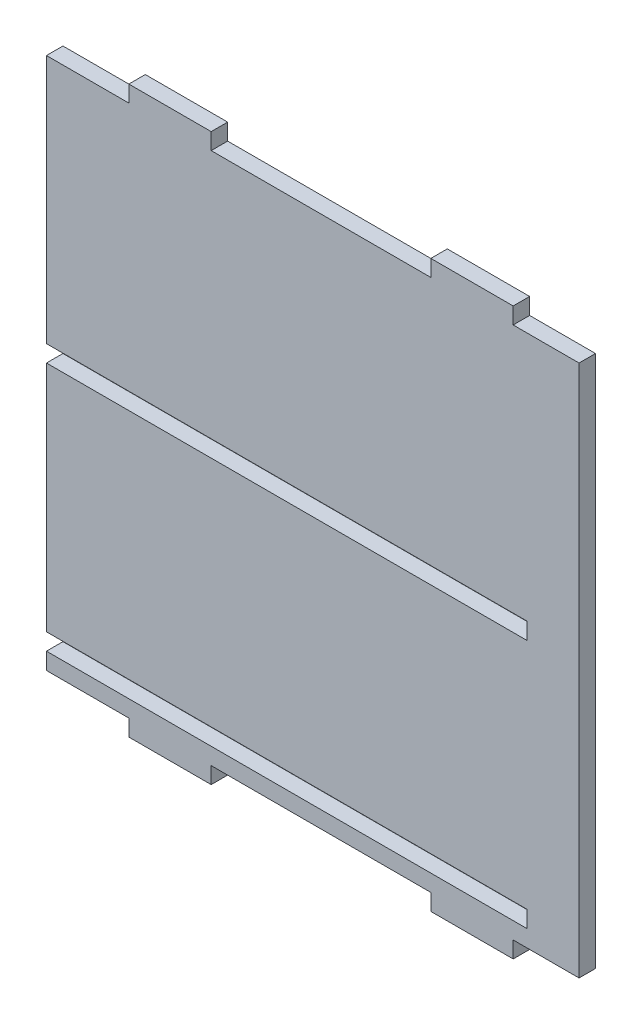
ISO-10303-21;
HEADER;
FILE_DESCRIPTION(('STEP AP214'),'2;1');
FILE_NAME('part.step','',(''),(''),'','','');
FILE_SCHEMA(('AUTOMOTIVE_DESIGN { 1 0 10303 214 1 1 1 1 }'));
ENDSEC;
DATA;
#1=APPLICATION_CONTEXT('core data for automotive mechanical design processes');
#2=APPLICATION_PROTOCOL_DEFINITION('international standard','automotive_design',2000,#1);
#3=PRODUCT_CONTEXT('',#1,'mechanical');
#4=PRODUCT('Part','Part','',(#3));
#5=PRODUCT_RELATED_PRODUCT_CATEGORY('part','',(#4));
#6=PRODUCT_DEFINITION_FORMATION('','',#4);
#7=PRODUCT_DEFINITION_CONTEXT('part definition',#1,'design');
#8=PRODUCT_DEFINITION('design','',#6,#7);
#9=PRODUCT_DEFINITION_SHAPE('','',#8);
#10=(LENGTH_UNIT() NAMED_UNIT(*) SI_UNIT(.MILLI.,.METRE.));
#11=(NAMED_UNIT(*) PLANE_ANGLE_UNIT() SI_UNIT($,.RADIAN.));
#12=(NAMED_UNIT(*) SI_UNIT($,.STERADIAN.) SOLID_ANGLE_UNIT());
#13=UNCERTAINTY_MEASURE_WITH_UNIT(LENGTH_MEASURE(1.E-05),#10,'distance_accuracy_value','');
#14=(GEOMETRIC_REPRESENTATION_CONTEXT(3) GLOBAL_UNCERTAINTY_ASSIGNED_CONTEXT((#13)) GLOBAL_UNIT_ASSIGNED_CONTEXT((#10,
#11,#12)) REPRESENTATION_CONTEXT('',''));
#15=CARTESIAN_POINT('',(0.,0.,0.));
#16=DIRECTION('',(0.,0.,1.));
#17=DIRECTION('',(1.,0.,0.));
#18=AXIS2_PLACEMENT_3D('',#15,#16,#17);
#19=CARTESIAN_POINT('',(-97.,97.,6.));
#20=DIRECTION('',(1.,0.,0.));
#21=DIRECTION('',(0.,1.,0.));
#22=AXIS2_PLACEMENT_3D('',#19,#20,#21);
#23=PLANE('',#22);
#24=DIRECTION('',(0.,-1.,0.));
#25=VECTOR('',#24,1.);
#26=CARTESIAN_POINT('',(-97.,97.,0.));
#27=LINE('',#26,#25);
#28=CARTESIAN_POINT('',(-97.,97.,0.));
#29=VERTEX_POINT('',#28);
#30=CARTESIAN_POINT('',(-97.,6.1,0.));
#31=VERTEX_POINT('',#30);
#32=EDGE_CURVE('E327',#29,#31,#27,.T.);
#33=ORIENTED_EDGE('',*,*,#32,.T.);
#34=DIRECTION('',(0.,0.,1.));
#35=VECTOR('',#34,1.);
#36=CARTESIAN_POINT('',(-97.,6.1,-4.));
#37=LINE('',#36,#35);
#38=CARTESIAN_POINT('',(-97.,6.1,6.));
#39=VERTEX_POINT('',#38);
#40=EDGE_CURVE('E296',#31,#39,#37,.T.);
#41=ORIENTED_EDGE('',*,*,#40,.T.);
#42=DIRECTION('',(0.,-1.,0.));
#43=VECTOR('',#42,1.);
#44=CARTESIAN_POINT('',(-97.,97.,6.));
#45=LINE('',#44,#43);
#46=CARTESIAN_POINT('',(-97.,97.,6.));
#47=VERTEX_POINT('',#46);
#48=EDGE_CURVE('E257',#47,#39,#45,.T.);
#49=ORIENTED_EDGE('',*,*,#48,.F.);
#50=DIRECTION('',(0.,0.,-1.));
#51=VECTOR('',#50,1.);
#52=CARTESIAN_POINT('',(-97.,97.,6.));
#53=LINE('',#52,#51);
#54=EDGE_CURVE('E392',#47,#29,#53,.T.);
#55=ORIENTED_EDGE('',*,*,#54,.T.);
#56=EDGE_LOOP('',(#33,#41,#49,#55));
#57=FACE_BOUND('',#56,.T.);
#58=ADVANCED_FACE('F44',(#57),#23,.F.);
#59=CARTESIAN_POINT('',(-97.,0.,6.));
#60=VERTEX_POINT('',#59);
#61=CARTESIAN_POINT('',(-97.,-84.8,6.));
#62=VERTEX_POINT('',#61);
#63=EDGE_CURVE('E246',#60,#62,#45,.T.);
#64=ORIENTED_EDGE('',*,*,#63,.F.);
#65=DIRECTION('',(0.,0.,1.));
#66=VECTOR('',#65,1.);
#67=CARTESIAN_POINT('',(-97.,0.,-4.));
#68=LINE('',#67,#66);
#69=CARTESIAN_POINT('',(-97.,0.,0.));
#70=VERTEX_POINT('',#69);
#71=EDGE_CURVE('E227',#70,#60,#68,.T.);
#72=ORIENTED_EDGE('',*,*,#71,.F.);
#73=CARTESIAN_POINT('',(-97.,-84.8,0.));
#74=VERTEX_POINT('',#73);
#75=EDGE_CURVE('E332',#70,#74,#27,.T.);
#76=ORIENTED_EDGE('',*,*,#75,.T.);
#77=DIRECTION('',(0.,0.,1.));
#78=VECTOR('',#77,1.);
#79=CARTESIAN_POINT('',(-97.,-84.8,-4.));
#80=LINE('',#79,#78);
#81=EDGE_CURVE('E255',#74,#62,#80,.T.);
#82=ORIENTED_EDGE('',*,*,#81,.T.);
#83=EDGE_LOOP('',(#64,#72,#76,#82));
#84=FACE_BOUND('',#83,.T.);
#85=ADVANCED_FACE('F254',(#84),#23,.F.);
#86=CARTESIAN_POINT('',(73.,-97.,6.));
#87=DIRECTION('',(0.,1.,0.));
#88=DIRECTION('',(-1.,0.,0.));
#89=AXIS2_PLACEMENT_3D('',#86,#87,#88);
#90=PLANE('',#89);
#91=DIRECTION('',(1.,0.,0.));
#92=VECTOR('',#91,1.);
#93=CARTESIAN_POINT('',(73.,-97.,0.));
#94=LINE('',#93,#92);
#95=CARTESIAN_POINT('',(73.,-97.,0.));
#96=VERTEX_POINT('',#95);
#97=CARTESIAN_POINT('',(97.,-97.,0.));
#98=VERTEX_POINT('',#97);
#99=EDGE_CURVE('E291',#96,#98,#94,.T.);
#100=ORIENTED_EDGE('',*,*,#99,.T.);
#101=DIRECTION('',(0.,0.,-1.));
#102=VECTOR('',#101,1.);
#103=CARTESIAN_POINT('',(97.,-97.,6.));
#104=LINE('',#103,#102);
#105=CARTESIAN_POINT('',(97.,-97.,6.));
#106=VERTEX_POINT('',#105);
#107=EDGE_CURVE('E432',#106,#98,#104,.T.);
#108=ORIENTED_EDGE('',*,*,#107,.F.);
#109=DIRECTION('',(1.,0.,0.));
#110=VECTOR('',#109,1.);
#111=CARTESIAN_POINT('',(73.,-97.,6.));
#112=LINE('',#111,#110);
#113=CARTESIAN_POINT('',(73.,-97.,6.));
#114=VERTEX_POINT('',#113);
#115=EDGE_CURVE('E356',#114,#106,#112,.T.);
#116=ORIENTED_EDGE('',*,*,#115,.F.);
#117=DIRECTION('',(0.,0.,-1.));
#118=VECTOR('',#117,1.);
#119=CARTESIAN_POINT('',(73.,-97.,6.));
#120=LINE('',#119,#118);
#121=EDGE_CURVE('E290',#114,#96,#120,.T.);
#122=ORIENTED_EDGE('',*,*,#121,.T.);
#123=EDGE_LOOP('',(#100,#108,#116,#122));
#124=FACE_BOUND('',#123,.T.);
#125=ADVANCED_FACE('F46',(#124),#90,.F.);
#126=CARTESIAN_POINT('',(97.,97.,6.));
#127=DIRECTION('',(-1.,0.,0.));
#128=DIRECTION('',(0.,-1.,0.));
#129=AXIS2_PLACEMENT_3D('',#126,#127,#128);
#130=PLANE('',#129);
#131=DIRECTION('',(0.,1.,0.));
#132=VECTOR('',#131,1.);
#133=CARTESIAN_POINT('',(97.,97.,0.));
#134=LINE('',#133,#132);
#135=CARTESIAN_POINT('',(97.,97.,0.));
#136=VERTEX_POINT('',#135);
#137=EDGE_CURVE('E295',#98,#136,#134,.T.);
#138=ORIENTED_EDGE('',*,*,#137,.T.);
#139=DIRECTION('',(0.,0.,-1.));
#140=VECTOR('',#139,1.);
#141=CARTESIAN_POINT('',(97.,97.,6.));
#142=LINE('',#141,#140);
#143=CARTESIAN_POINT('',(97.,97.,6.));
#144=VERTEX_POINT('',#143);
#145=EDGE_CURVE('E428',#144,#136,#142,.T.);
#146=ORIENTED_EDGE('',*,*,#145,.F.);
#147=DIRECTION('',(0.,1.,0.));
#148=VECTOR('',#147,1.);
#149=CARTESIAN_POINT('',(97.,97.,6.));
#150=LINE('',#149,#148);
#151=EDGE_CURVE('E499',#106,#144,#150,.T.);
#152=ORIENTED_EDGE('',*,*,#151,.F.);
#153=ORIENTED_EDGE('',*,*,#107,.T.);
#154=EDGE_LOOP('',(#138,#146,#152,#153));
#155=FACE_BOUND('',#154,.T.);
#156=ADVANCED_FACE('F618',(#155),#130,.F.);
#157=CARTESIAN_POINT('',(73.,97.,6.));
#158=DIRECTION('',(0.,-1.,0.));
#159=DIRECTION('',(0.,0.,-1.));
#160=AXIS2_PLACEMENT_3D('',#157,#158,#159);
#161=PLANE('',#160);
#162=DIRECTION('',(-1.,0.,0.));
#163=VECTOR('',#162,1.);
#164=CARTESIAN_POINT('',(73.,97.,0.));
#165=LINE('',#164,#163);
#166=CARTESIAN_POINT('',(73.,97.,0.));
#167=VERTEX_POINT('',#166);
#168=EDGE_CURVE('E299',#136,#167,#165,.T.);
#169=ORIENTED_EDGE('',*,*,#168,.T.);
#170=DIRECTION('',(0.,0.,-1.));
#171=VECTOR('',#170,1.);
#172=CARTESIAN_POINT('',(73.,97.,6.));
#173=LINE('',#172,#171);
#174=CARTESIAN_POINT('',(73.,97.,6.));
#175=VERTEX_POINT('',#174);
#176=EDGE_CURVE('E424',#175,#167,#173,.T.);
#177=ORIENTED_EDGE('',*,*,#176,.F.);
#178=DIRECTION('',(-1.,0.,0.));
#179=VECTOR('',#178,1.);
#180=CARTESIAN_POINT('',(73.,97.,6.));
#181=LINE('',#180,#179);
#182=EDGE_CURVE('E502',#144,#175,#181,.T.);
#183=ORIENTED_EDGE('',*,*,#182,.F.);
#184=ORIENTED_EDGE('',*,*,#145,.T.);
#185=EDGE_LOOP('',(#169,#177,#183,#184));
#186=FACE_BOUND('',#185,.T.);
#187=ADVANCED_FACE('F615',(#186),#161,.F.);
#188=CARTESIAN_POINT('',(73.,97.,6.));
#189=DIRECTION('',(-1.,0.,0.));
#190=DIRECTION('',(0.,0.,1.));
#191=AXIS2_PLACEMENT_3D('',#188,#189,#190);
#192=PLANE('',#191);
#193=DIRECTION('',(0.,1.,0.));
#194=VECTOR('',#193,1.);
#195=CARTESIAN_POINT('',(73.,97.,0.));
#196=LINE('',#195,#194);
#197=CARTESIAN_POINT('',(73.,103.,0.));
#198=VERTEX_POINT('',#197);
#199=EDGE_CURVE('E302',#167,#198,#196,.T.);
#200=ORIENTED_EDGE('',*,*,#199,.T.);
#201=DIRECTION('',(0.,0.,-1.));
#202=VECTOR('',#201,1.);
#203=CARTESIAN_POINT('',(73.,103.,6.));
#204=LINE('',#203,#202);
#205=CARTESIAN_POINT('',(73.,103.,6.));
#206=VERTEX_POINT('',#205);
#207=EDGE_CURVE('E420',#206,#198,#204,.T.);
#208=ORIENTED_EDGE('',*,*,#207,.F.);
#209=DIRECTION('',(0.,1.,0.));
#210=VECTOR('',#209,1.);
#211=CARTESIAN_POINT('',(73.,97.,6.));
#212=LINE('',#211,#210);
#213=EDGE_CURVE('E505',#175,#206,#212,.T.);
#214=ORIENTED_EDGE('',*,*,#213,.F.);
#215=ORIENTED_EDGE('',*,*,#176,.T.);
#216=EDGE_LOOP('',(#200,#208,#214,#215));
#217=FACE_BOUND('',#216,.T.);
#218=ADVANCED_FACE('F611',(#217),#192,.F.);
#219=CARTESIAN_POINT('',(43.,103.,6.));
#220=DIRECTION('',(0.,-1.,0.));
#221=DIRECTION('',(0.,0.,-1.));
#222=AXIS2_PLACEMENT_3D('',#219,#220,#221);
#223=PLANE('',#222);
#224=DIRECTION('',(-1.,0.,0.));
#225=VECTOR('',#224,1.);
#226=CARTESIAN_POINT('',(43.,103.,0.));
#227=LINE('',#226,#225);
#228=CARTESIAN_POINT('',(43.,103.,0.));
#229=VERTEX_POINT('',#228);
#230=EDGE_CURVE('E305',#198,#229,#227,.T.);
#231=ORIENTED_EDGE('',*,*,#230,.T.);
#232=DIRECTION('',(0.,0.,-1.));
#233=VECTOR('',#232,1.);
#234=CARTESIAN_POINT('',(43.,103.,6.));
#235=LINE('',#234,#233);
#236=CARTESIAN_POINT('',(43.,103.,6.));
#237=VERTEX_POINT('',#236);
#238=EDGE_CURVE('E416',#237,#229,#235,.T.);
#239=ORIENTED_EDGE('',*,*,#238,.F.);
#240=DIRECTION('',(-1.,0.,0.));
#241=VECTOR('',#240,1.);
#242=CARTESIAN_POINT('',(43.,103.,6.));
#243=LINE('',#242,#241);
#244=EDGE_CURVE('E508',#206,#237,#243,.T.);
#245=ORIENTED_EDGE('',*,*,#244,.F.);
#246=ORIENTED_EDGE('',*,*,#207,.T.);
#247=EDGE_LOOP('',(#231,#239,#245,#246));
#248=FACE_BOUND('',#247,.T.);
#249=ADVANCED_FACE('F607',(#248),#223,.F.);
#250=CARTESIAN_POINT('',(43.,97.,6.));
#251=DIRECTION('',(1.,0.,0.));
#252=DIRECTION('',(0.,0.,-1.));
#253=AXIS2_PLACEMENT_3D('',#250,#251,#252);
#254=PLANE('',#253);
#255=DIRECTION('',(0.,-1.,0.));
#256=VECTOR('',#255,1.);
#257=CARTESIAN_POINT('',(43.,97.,0.));
#258=LINE('',#257,#256);
#259=CARTESIAN_POINT('',(43.,97.,0.));
#260=VERTEX_POINT('',#259);
#261=EDGE_CURVE('E308',#229,#260,#258,.T.);
#262=ORIENTED_EDGE('',*,*,#261,.T.);
#263=DIRECTION('',(0.,0.,-1.));
#264=VECTOR('',#263,1.);
#265=CARTESIAN_POINT('',(43.,97.,6.));
#266=LINE('',#265,#264);
#267=CARTESIAN_POINT('',(43.,97.,6.));
#268=VERTEX_POINT('',#267);
#269=EDGE_CURVE('E412',#268,#260,#266,.T.);
#270=ORIENTED_EDGE('',*,*,#269,.F.);
#271=DIRECTION('',(0.,-1.,0.));
#272=VECTOR('',#271,1.);
#273=CARTESIAN_POINT('',(43.,97.,6.));
#274=LINE('',#273,#272);
#275=EDGE_CURVE('E511',#237,#268,#274,.T.);
#276=ORIENTED_EDGE('',*,*,#275,.F.);
#277=ORIENTED_EDGE('',*,*,#238,.T.);
#278=EDGE_LOOP('',(#262,#270,#276,#277));
#279=FACE_BOUND('',#278,.T.);
#280=ADVANCED_FACE('F603',(#279),#254,.F.);
#281=CARTESIAN_POINT('',(43.,97.,6.));
#282=DIRECTION('',(0.,-1.,0.));
#283=DIRECTION('',(0.,0.,-1.));
#284=AXIS2_PLACEMENT_3D('',#281,#282,#283);
#285=PLANE('',#284);
#286=DIRECTION('',(-1.,0.,0.));
#287=VECTOR('',#286,1.);
#288=CARTESIAN_POINT('',(43.,97.,0.));
#289=LINE('',#288,#287);
#290=CARTESIAN_POINT('',(-37.,97.,0.));
#291=VERTEX_POINT('',#290);
#292=EDGE_CURVE('E311',#260,#291,#289,.T.);
#293=ORIENTED_EDGE('',*,*,#292,.T.);
#294=DIRECTION('',(0.,0.,-1.));
#295=VECTOR('',#294,1.);
#296=CARTESIAN_POINT('',(-37.,97.,6.));
#297=LINE('',#296,#295);
#298=CARTESIAN_POINT('',(-37.,97.,6.));
#299=VERTEX_POINT('',#298);
#300=EDGE_CURVE('E408',#299,#291,#297,.T.);
#301=ORIENTED_EDGE('',*,*,#300,.F.);
#302=DIRECTION('',(-1.,0.,0.));
#303=VECTOR('',#302,1.);
#304=CARTESIAN_POINT('',(43.,97.,6.));
#305=LINE('',#304,#303);
#306=EDGE_CURVE('E514',#268,#299,#305,.T.);
#307=ORIENTED_EDGE('',*,*,#306,.F.);
#308=ORIENTED_EDGE('',*,*,#269,.T.);
#309=EDGE_LOOP('',(#293,#301,#307,#308));
#310=FACE_BOUND('',#309,.T.);
#311=ADVANCED_FACE('F599',(#310),#285,.F.);
#312=CARTESIAN_POINT('',(-37.,97.,6.));
#313=DIRECTION('',(-1.,0.,0.));
#314=DIRECTION('',(0.,0.,1.));
#315=AXIS2_PLACEMENT_3D('',#312,#313,#314);
#316=PLANE('',#315);
#317=DIRECTION('',(0.,1.,0.));
#318=VECTOR('',#317,1.);
#319=CARTESIAN_POINT('',(-37.,97.,0.));
#320=LINE('',#319,#318);
#321=CARTESIAN_POINT('',(-37.,103.,0.));
#322=VERTEX_POINT('',#321);
#323=EDGE_CURVE('E314',#291,#322,#320,.T.);
#324=ORIENTED_EDGE('',*,*,#323,.T.);
#325=DIRECTION('',(0.,0.,-1.));
#326=VECTOR('',#325,1.);
#327=CARTESIAN_POINT('',(-37.,103.,6.));
#328=LINE('',#327,#326);
#329=CARTESIAN_POINT('',(-37.,103.,6.));
#330=VERTEX_POINT('',#329);
#331=EDGE_CURVE('E404',#330,#322,#328,.T.);
#332=ORIENTED_EDGE('',*,*,#331,.F.);
#333=DIRECTION('',(0.,1.,0.));
#334=VECTOR('',#333,1.);
#335=CARTESIAN_POINT('',(-37.,97.,6.));
#336=LINE('',#335,#334);
#337=EDGE_CURVE('E517',#299,#330,#336,.T.);
#338=ORIENTED_EDGE('',*,*,#337,.F.);
#339=ORIENTED_EDGE('',*,*,#300,.T.);
#340=EDGE_LOOP('',(#324,#332,#338,#339));
#341=FACE_BOUND('',#340,.T.);
#342=ADVANCED_FACE('F595',(#341),#316,.F.);
#343=CARTESIAN_POINT('',(-67.,103.,6.));
#344=DIRECTION('',(0.,-1.,0.));
#345=DIRECTION('',(0.,0.,-1.));
#346=AXIS2_PLACEMENT_3D('',#343,#344,#345);
#347=PLANE('',#346);
#348=DIRECTION('',(-1.,0.,0.));
#349=VECTOR('',#348,1.);
#350=CARTESIAN_POINT('',(-67.,103.,0.));
#351=LINE('',#350,#349);
#352=CARTESIAN_POINT('',(-67.,103.,0.));
#353=VERTEX_POINT('',#352);
#354=EDGE_CURVE('E317',#322,#353,#351,.T.);
#355=ORIENTED_EDGE('',*,*,#354,.T.);
#356=DIRECTION('',(0.,0.,-1.));
#357=VECTOR('',#356,1.);
#358=CARTESIAN_POINT('',(-67.,103.,6.));
#359=LINE('',#358,#357);
#360=CARTESIAN_POINT('',(-67.,103.,6.));
#361=VERTEX_POINT('',#360);
#362=EDGE_CURVE('E400',#361,#353,#359,.T.);
#363=ORIENTED_EDGE('',*,*,#362,.F.);
#364=DIRECTION('',(-1.,0.,0.));
#365=VECTOR('',#364,1.);
#366=CARTESIAN_POINT('',(-67.,103.,6.));
#367=LINE('',#366,#365);
#368=EDGE_CURVE('E520',#330,#361,#367,.T.);
#369=ORIENTED_EDGE('',*,*,#368,.F.);
#370=ORIENTED_EDGE('',*,*,#331,.T.);
#371=EDGE_LOOP('',(#355,#363,#369,#370));
#372=FACE_BOUND('',#371,.T.);
#373=ADVANCED_FACE('F589',(#372),#347,.F.);
#374=CARTESIAN_POINT('',(-67.,97.,6.));
#375=DIRECTION('',(1.,0.,0.));
#376=DIRECTION('',(0.,0.,-1.));
#377=AXIS2_PLACEMENT_3D('',#374,#375,#376);
#378=PLANE('',#377);
#379=DIRECTION('',(0.,-1.,0.));
#380=VECTOR('',#379,1.);
#381=CARTESIAN_POINT('',(-67.,97.,0.));
#382=LINE('',#381,#380);
#383=CARTESIAN_POINT('',(-67.,97.,0.));
#384=VERTEX_POINT('',#383);
#385=EDGE_CURVE('E320',#353,#384,#382,.T.);
#386=ORIENTED_EDGE('',*,*,#385,.T.);
#387=DIRECTION('',(0.,0.,-1.));
#388=VECTOR('',#387,1.);
#389=CARTESIAN_POINT('',(-67.,97.,6.));
#390=LINE('',#389,#388);
#391=CARTESIAN_POINT('',(-67.,97.,6.));
#392=VERTEX_POINT('',#391);
#393=EDGE_CURVE('E396',#392,#384,#390,.T.);
#394=ORIENTED_EDGE('',*,*,#393,.F.);
#395=DIRECTION('',(0.,-1.,0.));
#396=VECTOR('',#395,1.);
#397=CARTESIAN_POINT('',(-67.,97.,6.));
#398=LINE('',#397,#396);
#399=EDGE_CURVE('E522',#361,#392,#398,.T.);
#400=ORIENTED_EDGE('',*,*,#399,.F.);
#401=ORIENTED_EDGE('',*,*,#362,.T.);
#402=EDGE_LOOP('',(#386,#394,#400,#401));
#403=FACE_BOUND('',#402,.T.);
#404=ADVANCED_FACE('F585',(#403),#378,.F.);
#405=CARTESIAN_POINT('',(-67.,97.,6.));
#406=DIRECTION('',(0.,-1.,0.));
#407=DIRECTION('',(0.,0.,-1.));
#408=AXIS2_PLACEMENT_3D('',#405,#406,#407);
#409=PLANE('',#408);
#410=DIRECTION('',(-1.,0.,0.));
#411=VECTOR('',#410,1.);
#412=CARTESIAN_POINT('',(-67.,97.,0.));
#413=LINE('',#412,#411);
#414=EDGE_CURVE('E323',#384,#29,#413,.T.);
#415=ORIENTED_EDGE('',*,*,#414,.T.);
#416=ORIENTED_EDGE('',*,*,#54,.F.);
#417=DIRECTION('',(-1.,0.,0.));
#418=VECTOR('',#417,1.);
#419=CARTESIAN_POINT('',(-67.,97.,6.));
#420=LINE('',#419,#418);
#421=EDGE_CURVE('E263',#392,#47,#420,.T.);
#422=ORIENTED_EDGE('',*,*,#421,.F.);
#423=ORIENTED_EDGE('',*,*,#393,.T.);
#424=EDGE_LOOP('',(#415,#416,#422,#423));
#425=FACE_BOUND('',#424,.T.);
#426=ADVANCED_FACE('F531',(#425),#409,.F.);
#427=CARTESIAN_POINT('',(-97.,-90.9,6.));
#428=VERTEX_POINT('',#427);
#429=CARTESIAN_POINT('',(-97.,-97.,6.));
#430=VERTEX_POINT('',#429);
#431=EDGE_CURVE('E258',#428,#430,#45,.T.);
#432=ORIENTED_EDGE('',*,*,#431,.F.);
#433=DIRECTION('',(0.,0.,1.));
#434=VECTOR('',#433,1.);
#435=CARTESIAN_POINT('',(-97.,-90.9,-4.));
#436=LINE('',#435,#434);
#437=CARTESIAN_POINT('',(-97.,-90.9,0.));
#438=VERTEX_POINT('',#437);
#439=EDGE_CURVE('E466',#438,#428,#436,.T.);
#440=ORIENTED_EDGE('',*,*,#439,.F.);
#441=CARTESIAN_POINT('',(-97.,-97.,0.));
#442=VERTEX_POINT('',#441);
#443=EDGE_CURVE('E326',#438,#442,#27,.T.);
#444=ORIENTED_EDGE('',*,*,#443,.T.);
#445=DIRECTION('',(0.,0.,-1.));
#446=VECTOR('',#445,1.);
#447=CARTESIAN_POINT('',(-97.,-97.,6.));
#448=LINE('',#447,#446);
#449=EDGE_CURVE('E388',#430,#442,#448,.T.);
#450=ORIENTED_EDGE('',*,*,#449,.F.);
#451=EDGE_LOOP('',(#432,#440,#444,#450));
#452=FACE_BOUND('',#451,.T.);
#453=ADVANCED_FACE('F464',(#452),#23,.F.);
#454=CARTESIAN_POINT('',(-67.,-97.,6.));
#455=DIRECTION('',(0.,1.,0.));
#456=DIRECTION('',(0.,0.,1.));
#457=AXIS2_PLACEMENT_3D('',#454,#455,#456);
#458=PLANE('',#457);
#459=DIRECTION('',(1.,0.,0.));
#460=VECTOR('',#459,1.);
#461=CARTESIAN_POINT('',(-67.,-97.,0.));
#462=LINE('',#461,#460);
#463=CARTESIAN_POINT('',(-67.,-97.,0.));
#464=VERTEX_POINT('',#463);
#465=EDGE_CURVE('E331',#442,#464,#462,.T.);
#466=ORIENTED_EDGE('',*,*,#465,.T.);
#467=DIRECTION('',(0.,0.,-1.));
#468=VECTOR('',#467,1.);
#469=CARTESIAN_POINT('',(-67.,-97.,6.));
#470=LINE('',#469,#468);
#471=CARTESIAN_POINT('',(-67.,-97.,6.));
#472=VERTEX_POINT('',#471);
#473=EDGE_CURVE('E384',#472,#464,#470,.T.);
#474=ORIENTED_EDGE('',*,*,#473,.F.);
#475=DIRECTION('',(1.,0.,0.));
#476=VECTOR('',#475,1.);
#477=CARTESIAN_POINT('',(-67.,-97.,6.));
#478=LINE('',#477,#476);
#479=EDGE_CURVE('E262',#430,#472,#478,.T.);
#480=ORIENTED_EDGE('',*,*,#479,.F.);
#481=ORIENTED_EDGE('',*,*,#449,.T.);
#482=EDGE_LOOP('',(#466,#474,#480,#481));
#483=FACE_BOUND('',#482,.T.);
#484=ADVANCED_FACE('F470',(#483),#458,.F.);
#485=CARTESIAN_POINT('',(-67.,-97.,6.));
#486=DIRECTION('',(1.,0.,0.));
#487=DIRECTION('',(0.,0.,-1.));
#488=AXIS2_PLACEMENT_3D('',#485,#486,#487);
#489=PLANE('',#488);
#490=DIRECTION('',(0.,-1.,0.));
#491=VECTOR('',#490,1.);
#492=CARTESIAN_POINT('',(-67.,-97.,0.));
#493=LINE('',#492,#491);
#494=CARTESIAN_POINT('',(-67.,-103.,0.));
#495=VERTEX_POINT('',#494);
#496=EDGE_CURVE('E335',#464,#495,#493,.T.);
#497=ORIENTED_EDGE('',*,*,#496,.T.);
#498=DIRECTION('',(0.,0.,-1.));
#499=VECTOR('',#498,1.);
#500=CARTESIAN_POINT('',(-67.,-103.,6.));
#501=LINE('',#500,#499);
#502=CARTESIAN_POINT('',(-67.,-103.,6.));
#503=VERTEX_POINT('',#502);
#504=EDGE_CURVE('E380',#503,#495,#501,.T.);
#505=ORIENTED_EDGE('',*,*,#504,.F.);
#506=DIRECTION('',(0.,-1.,0.));
#507=VECTOR('',#506,1.);
#508=CARTESIAN_POINT('',(-67.,-97.,6.));
#509=LINE('',#508,#507);
#510=EDGE_CURVE('E269',#472,#503,#509,.T.);
#511=ORIENTED_EDGE('',*,*,#510,.F.);
#512=ORIENTED_EDGE('',*,*,#473,.T.);
#513=EDGE_LOOP('',(#497,#505,#511,#512));
#514=FACE_BOUND('',#513,.T.);
#515=ADVANCED_FACE('F477',(#514),#489,.F.);
#516=CARTESIAN_POINT('',(-67.,-103.,6.));
#517=DIRECTION('',(0.,1.,0.));
#518=DIRECTION('',(-1.,0.,0.));
#519=AXIS2_PLACEMENT_3D('',#516,#517,#518);
#520=PLANE('',#519);
#521=DIRECTION('',(1.,0.,0.));
#522=VECTOR('',#521,1.);
#523=CARTESIAN_POINT('',(-67.,-103.,0.));
#524=LINE('',#523,#522);
#525=CARTESIAN_POINT('',(-37.,-103.,0.));
#526=VERTEX_POINT('',#525);
#527=EDGE_CURVE('E338',#495,#526,#524,.T.);
#528=ORIENTED_EDGE('',*,*,#527,.T.);
#529=DIRECTION('',(0.,0.,-1.));
#530=VECTOR('',#529,1.);
#531=CARTESIAN_POINT('',(-37.,-103.,6.));
#532=LINE('',#531,#530);
#533=CARTESIAN_POINT('',(-37.,-103.,6.));
#534=VERTEX_POINT('',#533);
#535=EDGE_CURVE('E376',#534,#526,#532,.T.);
#536=ORIENTED_EDGE('',*,*,#535,.F.);
#537=DIRECTION('',(1.,0.,0.));
#538=VECTOR('',#537,1.);
#539=CARTESIAN_POINT('',(-67.,-103.,6.));
#540=LINE('',#539,#538);
#541=EDGE_CURVE('E272',#503,#534,#540,.T.);
#542=ORIENTED_EDGE('',*,*,#541,.F.);
#543=ORIENTED_EDGE('',*,*,#504,.T.);
#544=EDGE_LOOP('',(#528,#536,#542,#543));
#545=FACE_BOUND('',#544,.T.);
#546=ADVANCED_FACE('F481',(#545),#520,.F.);
#547=CARTESIAN_POINT('',(-37.,-97.,6.));
#548=DIRECTION('',(-1.,0.,0.));
#549=DIRECTION('',(0.,-1.,0.));
#550=AXIS2_PLACEMENT_3D('',#547,#548,#549);
#551=PLANE('',#550);
#552=DIRECTION('',(0.,1.,0.));
#553=VECTOR('',#552,1.);
#554=CARTESIAN_POINT('',(-37.,-97.,0.));
#555=LINE('',#554,#553);
#556=CARTESIAN_POINT('',(-37.,-97.,0.));
#557=VERTEX_POINT('',#556);
#558=EDGE_CURVE('E341',#526,#557,#555,.T.);
#559=ORIENTED_EDGE('',*,*,#558,.T.);
#560=DIRECTION('',(0.,0.,-1.));
#561=VECTOR('',#560,1.);
#562=CARTESIAN_POINT('',(-37.,-97.,6.));
#563=LINE('',#562,#561);
#564=CARTESIAN_POINT('',(-37.,-97.,6.));
#565=VERTEX_POINT('',#564);
#566=EDGE_CURVE('E372',#565,#557,#563,.T.);
#567=ORIENTED_EDGE('',*,*,#566,.F.);
#568=DIRECTION('',(0.,1.,0.));
#569=VECTOR('',#568,1.);
#570=CARTESIAN_POINT('',(-37.,-97.,6.));
#571=LINE('',#570,#569);
#572=EDGE_CURVE('E275',#534,#565,#571,.T.);
#573=ORIENTED_EDGE('',*,*,#572,.F.);
#574=ORIENTED_EDGE('',*,*,#535,.T.);
#575=EDGE_LOOP('',(#559,#567,#573,#574));
#576=FACE_BOUND('',#575,.T.);
#577=ADVANCED_FACE('F663',(#576),#551,.F.);
#578=CARTESIAN_POINT('',(-37.,-97.,6.));
#579=DIRECTION('',(0.,1.,0.));
#580=DIRECTION('',(-1.,0.,0.));
#581=AXIS2_PLACEMENT_3D('',#578,#579,#580);
#582=PLANE('',#581);
#583=DIRECTION('',(1.,0.,0.));
#584=VECTOR('',#583,1.);
#585=CARTESIAN_POINT('',(-37.,-97.,0.));
#586=LINE('',#585,#584);
#587=CARTESIAN_POINT('',(43.,-97.,0.));
#588=VERTEX_POINT('',#587);
#589=EDGE_CURVE('E344',#557,#588,#586,.T.);
#590=ORIENTED_EDGE('',*,*,#589,.T.);
#591=DIRECTION('',(0.,0.,-1.));
#592=VECTOR('',#591,1.);
#593=CARTESIAN_POINT('',(43.,-97.,6.));
#594=LINE('',#593,#592);
#595=CARTESIAN_POINT('',(43.,-97.,6.));
#596=VERTEX_POINT('',#595);
#597=EDGE_CURVE('E368',#596,#588,#594,.T.);
#598=ORIENTED_EDGE('',*,*,#597,.F.);
#599=DIRECTION('',(1.,0.,0.));
#600=VECTOR('',#599,1.);
#601=CARTESIAN_POINT('',(-37.,-97.,6.));
#602=LINE('',#601,#600);
#603=EDGE_CURVE('E278',#565,#596,#602,.T.);
#604=ORIENTED_EDGE('',*,*,#603,.F.);
#605=ORIENTED_EDGE('',*,*,#566,.T.);
#606=EDGE_LOOP('',(#590,#598,#604,#605));
#607=FACE_BOUND('',#606,.T.);
#608=ADVANCED_FACE('F660',(#607),#582,.F.);
#609=CARTESIAN_POINT('',(43.,-97.,6.));
#610=DIRECTION('',(1.,0.,0.));
#611=DIRECTION('',(0.,0.,-1.));
#612=AXIS2_PLACEMENT_3D('',#609,#610,#611);
#613=PLANE('',#612);
#614=DIRECTION('',(0.,-1.,0.));
#615=VECTOR('',#614,1.);
#616=CARTESIAN_POINT('',(43.,-97.,0.));
#617=LINE('',#616,#615);
#618=CARTESIAN_POINT('',(43.,-103.,0.));
#619=VERTEX_POINT('',#618);
#620=EDGE_CURVE('E347',#588,#619,#617,.T.);
#621=ORIENTED_EDGE('',*,*,#620,.T.);
#622=DIRECTION('',(0.,0.,-1.));
#623=VECTOR('',#622,1.);
#624=CARTESIAN_POINT('',(43.,-103.,6.));
#625=LINE('',#624,#623);
#626=CARTESIAN_POINT('',(43.,-103.,6.));
#627=VERTEX_POINT('',#626);
#628=EDGE_CURVE('E364',#627,#619,#625,.T.);
#629=ORIENTED_EDGE('',*,*,#628,.F.);
#630=DIRECTION('',(0.,-1.,0.));
#631=VECTOR('',#630,1.);
#632=CARTESIAN_POINT('',(43.,-97.,6.));
#633=LINE('',#632,#631);
#634=EDGE_CURVE('E281',#596,#627,#633,.T.);
#635=ORIENTED_EDGE('',*,*,#634,.F.);
#636=ORIENTED_EDGE('',*,*,#597,.T.);
#637=EDGE_LOOP('',(#621,#629,#635,#636));
#638=FACE_BOUND('',#637,.T.);
#639=ADVANCED_FACE('F656',(#638),#613,.F.);
#640=CARTESIAN_POINT('',(43.,-103.,6.));
#641=DIRECTION('',(0.,1.,0.));
#642=DIRECTION('',(0.,0.,1.));
#643=AXIS2_PLACEMENT_3D('',#640,#641,#642);
#644=PLANE('',#643);
#645=DIRECTION('',(1.,0.,0.));
#646=VECTOR('',#645,1.);
#647=CARTESIAN_POINT('',(43.,-103.,0.));
#648=LINE('',#647,#646);
#649=CARTESIAN_POINT('',(73.,-103.,0.));
#650=VERTEX_POINT('',#649);
#651=EDGE_CURVE('E350',#619,#650,#648,.T.);
#652=ORIENTED_EDGE('',*,*,#651,.T.);
#653=DIRECTION('',(0.,0.,-1.));
#654=VECTOR('',#653,1.);
#655=CARTESIAN_POINT('',(73.,-103.,6.));
#656=LINE('',#655,#654);
#657=CARTESIAN_POINT('',(73.,-103.,6.));
#658=VERTEX_POINT('',#657);
#659=EDGE_CURVE('E360',#658,#650,#656,.T.);
#660=ORIENTED_EDGE('',*,*,#659,.F.);
#661=DIRECTION('',(1.,0.,0.));
#662=VECTOR('',#661,1.);
#663=CARTESIAN_POINT('',(43.,-103.,6.));
#664=LINE('',#663,#662);
#665=EDGE_CURVE('E284',#627,#658,#664,.T.);
#666=ORIENTED_EDGE('',*,*,#665,.F.);
#667=ORIENTED_EDGE('',*,*,#628,.T.);
#668=EDGE_LOOP('',(#652,#660,#666,#667));
#669=FACE_BOUND('',#668,.T.);
#670=ADVANCED_FACE('F652',(#669),#644,.F.);
#671=CARTESIAN_POINT('',(73.,-97.,6.));
#672=DIRECTION('',(-1.,0.,0.));
#673=DIRECTION('',(0.,-1.,0.));
#674=AXIS2_PLACEMENT_3D('',#671,#672,#673);
#675=PLANE('',#674);
#676=DIRECTION('',(0.,1.,0.));
#677=VECTOR('',#676,1.);
#678=CARTESIAN_POINT('',(73.,-97.,0.));
#679=LINE('',#678,#677);
#680=EDGE_CURVE('E353',#650,#96,#679,.T.);
#681=ORIENTED_EDGE('',*,*,#680,.T.);
#682=ORIENTED_EDGE('',*,*,#121,.F.);
#683=DIRECTION('',(0.,1.,0.));
#684=VECTOR('',#683,1.);
#685=CARTESIAN_POINT('',(73.,-97.,6.));
#686=LINE('',#685,#684);
#687=EDGE_CURVE('E287',#658,#114,#686,.T.);
#688=ORIENTED_EDGE('',*,*,#687,.F.);
#689=ORIENTED_EDGE('',*,*,#659,.T.);
#690=EDGE_LOOP('',(#681,#682,#688,#689));
#691=FACE_BOUND('',#690,.T.);
#692=ADVANCED_FACE('F648',(#691),#675,.F.);
#693=CARTESIAN_POINT('',(0.,0.,6.));
#694=DIRECTION('',(0.,0.,-1.));
#695=DIRECTION('',(-1.,0.,0.));
#696=AXIS2_PLACEMENT_3D('',#693,#694,#695);
#697=PLANE('',#696);
#698=ORIENTED_EDGE('',*,*,#48,.T.);
#699=DIRECTION('',(-1.,0.,0.));
#700=VECTOR('',#699,1.);
#701=CARTESIAN_POINT('',(-97.,6.1,6.));
#702=LINE('',#701,#700);
#703=CARTESIAN_POINT('',(78.,6.1,6.));
#704=VERTEX_POINT('',#703);
#705=EDGE_CURVE('E239',#704,#39,#702,.T.);
#706=ORIENTED_EDGE('',*,*,#705,.F.);
#707=DIRECTION('',(0.,1.,0.));
#708=VECTOR('',#707,1.);
#709=CARTESIAN_POINT('',(78.,0.,6.));
#710=LINE('',#709,#708);
#711=CARTESIAN_POINT('',(78.,0.,6.));
#712=VERTEX_POINT('',#711);
#713=EDGE_CURVE('E249',#712,#704,#710,.T.);
#714=ORIENTED_EDGE('',*,*,#713,.F.);
#715=DIRECTION('',(1.,0.,0.));
#716=VECTOR('',#715,1.);
#717=CARTESIAN_POINT('',(-97.,0.,6.));
#718=LINE('',#717,#716);
#719=EDGE_CURVE('E230',#60,#712,#718,.T.);
#720=ORIENTED_EDGE('',*,*,#719,.F.);
#721=ORIENTED_EDGE('',*,*,#63,.T.);
#722=DIRECTION('',(-1.,0.,0.));
#723=VECTOR('',#722,1.);
#724=CARTESIAN_POINT('',(-97.,-84.8,6.));
#725=LINE('',#724,#723);
#726=CARTESIAN_POINT('',(78.,-84.8,6.));
#727=VERTEX_POINT('',#726);
#728=EDGE_CURVE('E492',#727,#62,#725,.T.);
#729=ORIENTED_EDGE('',*,*,#728,.F.);
#730=DIRECTION('',(0.,1.,0.));
#731=VECTOR('',#730,1.);
#732=CARTESIAN_POINT('',(78.,-90.9,6.));
#733=LINE('',#732,#731);
#734=CARTESIAN_POINT('',(78.,-90.9,6.));
#735=VERTEX_POINT('',#734);
#736=EDGE_CURVE('E488',#735,#727,#733,.T.);
#737=ORIENTED_EDGE('',*,*,#736,.F.);
#738=DIRECTION('',(1.,0.,0.));
#739=VECTOR('',#738,1.);
#740=CARTESIAN_POINT('',(-97.,-90.9,6.));
#741=LINE('',#740,#739);
#742=EDGE_CURVE('E251',#428,#735,#741,.T.);
#743=ORIENTED_EDGE('',*,*,#742,.F.);
#744=ORIENTED_EDGE('',*,*,#431,.T.);
#745=ORIENTED_EDGE('',*,*,#479,.T.);
#746=ORIENTED_EDGE('',*,*,#510,.T.);
#747=ORIENTED_EDGE('',*,*,#541,.T.);
#748=ORIENTED_EDGE('',*,*,#572,.T.);
#749=ORIENTED_EDGE('',*,*,#603,.T.);
#750=ORIENTED_EDGE('',*,*,#634,.T.);
#751=ORIENTED_EDGE('',*,*,#665,.T.);
#752=ORIENTED_EDGE('',*,*,#687,.T.);
#753=ORIENTED_EDGE('',*,*,#115,.T.);
#754=ORIENTED_EDGE('',*,*,#151,.T.);
#755=ORIENTED_EDGE('',*,*,#182,.T.);
#756=ORIENTED_EDGE('',*,*,#213,.T.);
#757=ORIENTED_EDGE('',*,*,#244,.T.);
#758=ORIENTED_EDGE('',*,*,#275,.T.);
#759=ORIENTED_EDGE('',*,*,#306,.T.);
#760=ORIENTED_EDGE('',*,*,#337,.T.);
#761=ORIENTED_EDGE('',*,*,#368,.T.);
#762=ORIENTED_EDGE('',*,*,#399,.T.);
#763=ORIENTED_EDGE('',*,*,#421,.T.);
#764=EDGE_LOOP('',(#698,#706,#714,#720,#721,#729,#737,#743,#744,#745,#746,#747,#748,#749,#750,
#751,#752,#753,#754,#755,#756,#757,#758,#759,#760,#761,#762,#763));
#765=FACE_BOUND('',#764,.T.);
#766=ADVANCED_FACE('F244',(#765),#697,.F.);
#767=CARTESIAN_POINT('',(0.,0.,0.));
#768=DIRECTION('',(0.,0.,-1.));
#769=DIRECTION('',(-1.,0.,0.));
#770=AXIS2_PLACEMENT_3D('',#767,#768,#769);
#771=PLANE('',#770);
#772=DIRECTION('',(1.,0.,0.));
#773=VECTOR('',#772,1.);
#774=CARTESIAN_POINT('',(0.,6.1,0.));
#775=LINE('',#774,#773);
#776=CARTESIAN_POINT('',(78.,6.1,0.));
#777=VERTEX_POINT('',#776);
#778=EDGE_CURVE('E11',#31,#777,#775,.T.);
#779=ORIENTED_EDGE('',*,*,#778,.F.);
#780=ORIENTED_EDGE('',*,*,#32,.F.);
#781=ORIENTED_EDGE('',*,*,#414,.F.);
#782=ORIENTED_EDGE('',*,*,#385,.F.);
#783=ORIENTED_EDGE('',*,*,#354,.F.);
#784=ORIENTED_EDGE('',*,*,#323,.F.);
#785=ORIENTED_EDGE('',*,*,#292,.F.);
#786=ORIENTED_EDGE('',*,*,#261,.F.);
#787=ORIENTED_EDGE('',*,*,#230,.F.);
#788=ORIENTED_EDGE('',*,*,#199,.F.);
#789=ORIENTED_EDGE('',*,*,#168,.F.);
#790=ORIENTED_EDGE('',*,*,#137,.F.);
#791=ORIENTED_EDGE('',*,*,#99,.F.);
#792=ORIENTED_EDGE('',*,*,#680,.F.);
#793=ORIENTED_EDGE('',*,*,#651,.F.);
#794=ORIENTED_EDGE('',*,*,#620,.F.);
#795=ORIENTED_EDGE('',*,*,#589,.F.);
#796=ORIENTED_EDGE('',*,*,#558,.F.);
#797=ORIENTED_EDGE('',*,*,#527,.F.);
#798=ORIENTED_EDGE('',*,*,#496,.F.);
#799=ORIENTED_EDGE('',*,*,#465,.F.);
#800=ORIENTED_EDGE('',*,*,#443,.F.);
#801=DIRECTION('',(-1.,0.,0.));
#802=VECTOR('',#801,1.);
#803=CARTESIAN_POINT('',(0.,-90.9,0.));
#804=LINE('',#803,#802);
#805=CARTESIAN_POINT('',(78.,-90.9,0.));
#806=VERTEX_POINT('',#805);
#807=EDGE_CURVE('E436',#806,#438,#804,.T.);
#808=ORIENTED_EDGE('',*,*,#807,.F.);
#809=DIRECTION('',(0.,-1.,0.));
#810=VECTOR('',#809,1.);
#811=CARTESIAN_POINT('',(78.,0.,0.));
#812=LINE('',#811,#810);
#813=CARTESIAN_POINT('',(78.,-84.8,0.));
#814=VERTEX_POINT('',#813);
#815=EDGE_CURVE('E439',#814,#806,#812,.T.);
#816=ORIENTED_EDGE('',*,*,#815,.F.);
#817=DIRECTION('',(1.,0.,0.));
#818=VECTOR('',#817,1.);
#819=CARTESIAN_POINT('',(0.,-84.8,0.));
#820=LINE('',#819,#818);
#821=EDGE_CURVE('E442',#74,#814,#820,.T.);
#822=ORIENTED_EDGE('',*,*,#821,.F.);
#823=ORIENTED_EDGE('',*,*,#75,.F.);
#824=DIRECTION('',(-1.,0.,0.));
#825=VECTOR('',#824,1.);
#826=CARTESIAN_POINT('',(0.,0.,0.));
#827=LINE('',#826,#825);
#828=CARTESIAN_POINT('',(78.,0.,0.));
#829=VERTEX_POINT('',#828);
#830=EDGE_CURVE('E233',#829,#70,#827,.T.);
#831=ORIENTED_EDGE('',*,*,#830,.F.);
#832=DIRECTION('',(0.,-1.,0.));
#833=VECTOR('',#832,1.);
#834=CARTESIAN_POINT('',(78.,0.,0.));
#835=LINE('',#834,#833);
#836=EDGE_CURVE('E53',#777,#829,#835,.T.);
#837=ORIENTED_EDGE('',*,*,#836,.F.);
#838=EDGE_LOOP('',(#779,#780,#781,#782,#783,#784,#785,#786,#787,#788,#789,#790,#791,#792,#793,
#794,#795,#796,#797,#798,#799,#800,#808,#816,#822,#823,#831,#837));
#839=FACE_BOUND('',#838,.T.);
#840=ADVANCED_FACE('F454',(#839),#771,.T.);
#841=CARTESIAN_POINT('',(-97.,-84.8,-4.));
#842=DIRECTION('',(0.,1.,0.));
#843=DIRECTION('',(0.,0.,1.));
#844=AXIS2_PLACEMENT_3D('',#841,#842,#843);
#845=PLANE('',#844);
#846=ORIENTED_EDGE('',*,*,#821,.T.);
#847=DIRECTION('',(0.,0.,1.));
#848=VECTOR('',#847,1.);
#849=CARTESIAN_POINT('',(78.,-84.8,-4.));
#850=LINE('',#849,#848);
#851=EDGE_CURVE('E550',#814,#727,#850,.T.);
#852=ORIENTED_EDGE('',*,*,#851,.T.);
#853=ORIENTED_EDGE('',*,*,#728,.T.);
#854=ORIENTED_EDGE('',*,*,#81,.F.);
#855=EDGE_LOOP('',(#846,#852,#853,#854));
#856=FACE_BOUND('',#855,.T.);
#857=ADVANCED_FACE('F556',(#856),#845,.F.);
#858=CARTESIAN_POINT('',(78.,-90.9,-4.));
#859=DIRECTION('',(1.,0.,0.));
#860=DIRECTION('',(0.,0.,-1.));
#861=AXIS2_PLACEMENT_3D('',#858,#859,#860);
#862=PLANE('',#861);
#863=ORIENTED_EDGE('',*,*,#815,.T.);
#864=DIRECTION('',(0.,0.,1.));
#865=VECTOR('',#864,1.);
#866=CARTESIAN_POINT('',(78.,-90.9,-4.));
#867=LINE('',#866,#865);
#868=EDGE_CURVE('E68',#806,#735,#867,.T.);
#869=ORIENTED_EDGE('',*,*,#868,.T.);
#870=ORIENTED_EDGE('',*,*,#736,.T.);
#871=ORIENTED_EDGE('',*,*,#851,.F.);
#872=EDGE_LOOP('',(#863,#869,#870,#871));
#873=FACE_BOUND('',#872,.T.);
#874=ADVANCED_FACE('F559',(#873),#862,.F.);
#875=CARTESIAN_POINT('',(-97.,-90.9,-4.));
#876=DIRECTION('',(0.,-1.,0.));
#877=DIRECTION('',(0.,0.,-1.));
#878=AXIS2_PLACEMENT_3D('',#875,#876,#877);
#879=PLANE('',#878);
#880=ORIENTED_EDGE('',*,*,#807,.T.);
#881=ORIENTED_EDGE('',*,*,#439,.T.);
#882=ORIENTED_EDGE('',*,*,#742,.T.);
#883=ORIENTED_EDGE('',*,*,#868,.F.);
#884=EDGE_LOOP('',(#880,#881,#882,#883));
#885=FACE_BOUND('',#884,.T.);
#886=ADVANCED_FACE('F560',(#885),#879,.F.);
#887=CARTESIAN_POINT('',(-97.,6.1,-4.));
#888=DIRECTION('',(0.,1.,0.));
#889=DIRECTION('',(0.,0.,1.));
#890=AXIS2_PLACEMENT_3D('',#887,#888,#889);
#891=PLANE('',#890);
#892=ORIENTED_EDGE('',*,*,#778,.T.);
#893=DIRECTION('',(0.,0.,1.));
#894=VECTOR('',#893,1.);
#895=CARTESIAN_POINT('',(78.,6.1,-4.));
#896=LINE('',#895,#894);
#897=EDGE_CURVE('E451',#777,#704,#896,.T.);
#898=ORIENTED_EDGE('',*,*,#897,.T.);
#899=ORIENTED_EDGE('',*,*,#705,.T.);
#900=ORIENTED_EDGE('',*,*,#40,.F.);
#901=EDGE_LOOP('',(#892,#898,#899,#900));
#902=FACE_BOUND('',#901,.T.);
#903=ADVANCED_FACE('F562',(#902),#891,.F.);
#904=CARTESIAN_POINT('',(78.,0.,-4.));
#905=DIRECTION('',(1.,0.,0.));
#906=DIRECTION('',(0.,0.,-1.));
#907=AXIS2_PLACEMENT_3D('',#904,#905,#906);
#908=PLANE('',#907);
#909=ORIENTED_EDGE('',*,*,#836,.T.);
#910=DIRECTION('',(0.,0.,1.));
#911=VECTOR('',#910,1.);
#912=CARTESIAN_POINT('',(78.,0.,-4.));
#913=LINE('',#912,#911);
#914=EDGE_CURVE('E60',#829,#712,#913,.T.);
#915=ORIENTED_EDGE('',*,*,#914,.T.);
#916=ORIENTED_EDGE('',*,*,#713,.T.);
#917=ORIENTED_EDGE('',*,*,#897,.F.);
#918=EDGE_LOOP('',(#909,#915,#916,#917));
#919=FACE_BOUND('',#918,.T.);
#920=ADVANCED_FACE('F450',(#919),#908,.F.);
#921=CARTESIAN_POINT('',(-97.,0.,-4.));
#922=DIRECTION('',(0.,-1.,0.));
#923=DIRECTION('',(1.,0.,0.));
#924=AXIS2_PLACEMENT_3D('',#921,#922,#923);
#925=PLANE('',#924);
#926=ORIENTED_EDGE('',*,*,#830,.T.);
#927=ORIENTED_EDGE('',*,*,#71,.T.);
#928=ORIENTED_EDGE('',*,*,#719,.T.);
#929=ORIENTED_EDGE('',*,*,#914,.F.);
#930=EDGE_LOOP('',(#926,#927,#928,#929));
#931=FACE_BOUND('',#930,.T.);
#932=ADVANCED_FACE('F229',(#931),#925,.F.);
#933=CLOSED_SHELL('',(#58,#85,#125,#156,#187,#218,#249,#280,#311,#342,#373,#404,#426,#453,#484,
#515,#546,#577,#608,#639,#670,#692,#766,#840,#857,#874,#886,#903,#920,#932));
#934=MANIFOLD_SOLID_BREP('B2',#933);
#935=ADVANCED_BREP_SHAPE_REPRESENTATION('',(#18,#934),#14);
#936=SHAPE_DEFINITION_REPRESENTATION(#9,#935);
ENDSEC;
END-ISO-10303-21;
